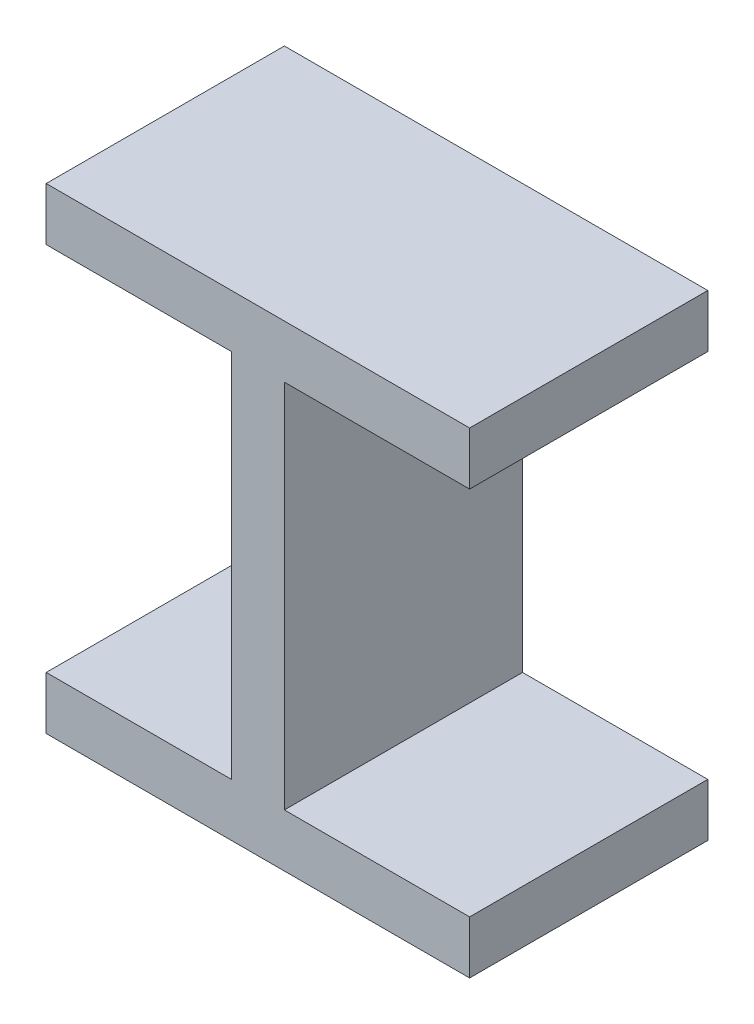
ISO-10303-21;
HEADER;
FILE_DESCRIPTION(('STEP AP214'),'2;1');
FILE_NAME('part.step','',(''),(''),'','','');
FILE_SCHEMA(('AUTOMOTIVE_DESIGN { 1 0 10303 214 1 1 1 1 }'));
ENDSEC;
DATA;
#1=APPLICATION_CONTEXT('core data for automotive mechanical design processes');
#2=APPLICATION_PROTOCOL_DEFINITION('international standard','automotive_design',2000,#1);
#3=PRODUCT_CONTEXT('',#1,'mechanical');
#4=PRODUCT('Part','Part','',(#3));
#5=PRODUCT_RELATED_PRODUCT_CATEGORY('part','',(#4));
#6=PRODUCT_DEFINITION_FORMATION('','',#4);
#7=PRODUCT_DEFINITION_CONTEXT('part definition',#1,'design');
#8=PRODUCT_DEFINITION('design','',#6,#7);
#9=PRODUCT_DEFINITION_SHAPE('','',#8);
#10=(LENGTH_UNIT() NAMED_UNIT(*) SI_UNIT(.MILLI.,.METRE.));
#11=(NAMED_UNIT(*) PLANE_ANGLE_UNIT() SI_UNIT($,.RADIAN.));
#12=(NAMED_UNIT(*) SI_UNIT($,.STERADIAN.) SOLID_ANGLE_UNIT());
#13=UNCERTAINTY_MEASURE_WITH_UNIT(LENGTH_MEASURE(1.E-05),#10,'distance_accuracy_value','');
#14=(GEOMETRIC_REPRESENTATION_CONTEXT(3) GLOBAL_UNCERTAINTY_ASSIGNED_CONTEXT((#13)) GLOBAL_UNIT_ASSIGNED_CONTEXT((#10,
#11,#12)) REPRESENTATION_CONTEXT('',''));
#15=CARTESIAN_POINT('',(0.,0.,0.));
#16=DIRECTION('',(0.,0.,1.));
#17=DIRECTION('',(1.,0.,0.));
#18=AXIS2_PLACEMENT_3D('',#15,#16,#17);
#19=CARTESIAN_POINT('',(80.,-90.,90.));
#20=DIRECTION('',(-1.,0.,0.));
#21=DIRECTION('',(0.,-1.,0.));
#22=AXIS2_PLACEMENT_3D('',#19,#20,#21);
#23=PLANE('',#22);
#24=DIRECTION('',(0.,1.,0.));
#25=VECTOR('',#24,1.);
#26=CARTESIAN_POINT('',(80.,-90.,0.));
#27=LINE('',#26,#25);
#28=CARTESIAN_POINT('',(80.,-90.,0.));
#29=VERTEX_POINT('',#28);
#30=CARTESIAN_POINT('',(80.,-70.,0.));
#31=VERTEX_POINT('',#30);
#32=EDGE_CURVE('E157',#29,#31,#27,.T.);
#33=ORIENTED_EDGE('',*,*,#32,.T.);
#34=DIRECTION('',(0.,0.,-1.));
#35=VECTOR('',#34,1.);
#36=CARTESIAN_POINT('',(80.,-70.,90.));
#37=LINE('',#36,#35);
#38=CARTESIAN_POINT('',(80.,-70.,90.));
#39=VERTEX_POINT('',#38);
#40=EDGE_CURVE('E11',#39,#31,#37,.T.);
#41=ORIENTED_EDGE('',*,*,#40,.F.);
#42=DIRECTION('',(0.,1.,0.));
#43=VECTOR('',#42,1.);
#44=CARTESIAN_POINT('',(80.,-90.,90.));
#45=LINE('',#44,#43);
#46=CARTESIAN_POINT('',(80.,-90.,90.));
#47=VERTEX_POINT('',#46);
#48=EDGE_CURVE('E179',#47,#39,#45,.T.);
#49=ORIENTED_EDGE('',*,*,#48,.F.);
#50=DIRECTION('',(0.,0.,-1.));
#51=VECTOR('',#50,1.);
#52=CARTESIAN_POINT('',(80.,-90.,90.));
#53=LINE('',#52,#51);
#54=EDGE_CURVE('E153',#47,#29,#53,.T.);
#55=ORIENTED_EDGE('',*,*,#54,.T.);
#56=EDGE_LOOP('',(#33,#41,#49,#55));
#57=FACE_BOUND('',#56,.T.);
#58=ADVANCED_FACE('F37',(#57),#23,.F.);
#59=CARTESIAN_POINT('',(80.,-70.,90.));
#60=DIRECTION('',(0.,-1.,0.));
#61=DIRECTION('',(1.,0.,0.));
#62=AXIS2_PLACEMENT_3D('',#59,#60,#61);
#63=PLANE('',#62);
#64=DIRECTION('',(-1.,0.,0.));
#65=VECTOR('',#64,1.);
#66=CARTESIAN_POINT('',(80.,-70.,0.));
#67=LINE('',#66,#65);
#68=CARTESIAN_POINT('',(10.,-70.,0.));
#69=VERTEX_POINT('',#68);
#70=EDGE_CURVE('E160',#31,#69,#67,.T.);
#71=ORIENTED_EDGE('',*,*,#70,.T.);
#72=DIRECTION('',(0.,0.,-1.));
#73=VECTOR('',#72,1.);
#74=CARTESIAN_POINT('',(10.,-70.,90.));
#75=LINE('',#74,#73);
#76=CARTESIAN_POINT('',(10.,-70.,90.));
#77=VERTEX_POINT('',#76);
#78=EDGE_CURVE('E45',#77,#69,#75,.T.);
#79=ORIENTED_EDGE('',*,*,#78,.F.);
#80=DIRECTION('',(-1.,0.,0.));
#81=VECTOR('',#80,1.);
#82=CARTESIAN_POINT('',(80.,-70.,90.));
#83=LINE('',#82,#81);
#84=EDGE_CURVE('E108',#39,#77,#83,.T.);
#85=ORIENTED_EDGE('',*,*,#84,.F.);
#86=ORIENTED_EDGE('',*,*,#40,.T.);
#87=EDGE_LOOP('',(#71,#79,#85,#86));
#88=FACE_BOUND('',#87,.T.);
#89=ADVANCED_FACE('F257',(#88),#63,.F.);
#90=CARTESIAN_POINT('',(10.,-70.,90.));
#91=DIRECTION('',(-1.,0.,0.));
#92=DIRECTION('',(0.,0.,1.));
#93=AXIS2_PLACEMENT_3D('',#90,#91,#92);
#94=PLANE('',#93);
#95=DIRECTION('',(0.,1.,0.));
#96=VECTOR('',#95,1.);
#97=CARTESIAN_POINT('',(10.,-70.,0.));
#98=LINE('',#97,#96);
#99=CARTESIAN_POINT('',(10.,70.,0.));
#100=VERTEX_POINT('',#99);
#101=EDGE_CURVE('E162',#69,#100,#98,.T.);
#102=ORIENTED_EDGE('',*,*,#101,.T.);
#103=DIRECTION('',(0.,0.,-1.));
#104=VECTOR('',#103,1.);
#105=CARTESIAN_POINT('',(10.,70.,90.));
#106=LINE('',#105,#104);
#107=CARTESIAN_POINT('',(10.,70.,90.));
#108=VERTEX_POINT('',#107);
#109=EDGE_CURVE('E198',#108,#100,#106,.T.);
#110=ORIENTED_EDGE('',*,*,#109,.F.);
#111=DIRECTION('',(0.,1.,0.));
#112=VECTOR('',#111,1.);
#113=CARTESIAN_POINT('',(10.,-70.,90.));
#114=LINE('',#113,#112);
#115=EDGE_CURVE('E206',#77,#108,#114,.T.);
#116=ORIENTED_EDGE('',*,*,#115,.F.);
#117=ORIENTED_EDGE('',*,*,#78,.T.);
#118=EDGE_LOOP('',(#102,#110,#116,#117));
#119=FACE_BOUND('',#118,.T.);
#120=ADVANCED_FACE('F204',(#119),#94,.F.);
#121=CARTESIAN_POINT('',(10.,70.,90.));
#122=DIRECTION('',(0.,1.,0.));
#123=DIRECTION('',(-1.,0.,0.));
#124=AXIS2_PLACEMENT_3D('',#121,#122,#123);
#125=PLANE('',#124);
#126=DIRECTION('',(1.,0.,0.));
#127=VECTOR('',#126,1.);
#128=CARTESIAN_POINT('',(10.,70.,0.));
#129=LINE('',#128,#127);
#130=CARTESIAN_POINT('',(80.,70.,0.));
#131=VERTEX_POINT('',#130);
#132=EDGE_CURVE('E164',#100,#131,#129,.T.);
#133=ORIENTED_EDGE('',*,*,#132,.T.);
#134=DIRECTION('',(0.,0.,-1.));
#135=VECTOR('',#134,1.);
#136=CARTESIAN_POINT('',(80.,70.,90.));
#137=LINE('',#136,#135);
#138=CARTESIAN_POINT('',(80.,70.,90.));
#139=VERTEX_POINT('',#138);
#140=EDGE_CURVE('E195',#139,#131,#137,.T.);
#141=ORIENTED_EDGE('',*,*,#140,.F.);
#142=DIRECTION('',(1.,0.,0.));
#143=VECTOR('',#142,1.);
#144=CARTESIAN_POINT('',(10.,70.,90.));
#145=LINE('',#144,#143);
#146=EDGE_CURVE('E224',#108,#139,#145,.T.);
#147=ORIENTED_EDGE('',*,*,#146,.F.);
#148=ORIENTED_EDGE('',*,*,#109,.T.);
#149=EDGE_LOOP('',(#133,#141,#147,#148));
#150=FACE_BOUND('',#149,.T.);
#151=ADVANCED_FACE('F215',(#150),#125,.F.);
#152=CARTESIAN_POINT('',(80.,70.,90.));
#153=DIRECTION('',(-1.,0.,0.));
#154=DIRECTION('',(0.,-1.,0.));
#155=AXIS2_PLACEMENT_3D('',#152,#153,#154);
#156=PLANE('',#155);
#157=DIRECTION('',(0.,1.,0.));
#158=VECTOR('',#157,1.);
#159=CARTESIAN_POINT('',(80.,70.,0.));
#160=LINE('',#159,#158);
#161=CARTESIAN_POINT('',(80.,90.,0.));
#162=VERTEX_POINT('',#161);
#163=EDGE_CURVE('E166',#131,#162,#160,.T.);
#164=ORIENTED_EDGE('',*,*,#163,.T.);
#165=DIRECTION('',(0.,0.,-1.));
#166=VECTOR('',#165,1.);
#167=CARTESIAN_POINT('',(80.,90.,90.));
#168=LINE('',#167,#166);
#169=CARTESIAN_POINT('',(80.,90.,90.));
#170=VERTEX_POINT('',#169);
#171=EDGE_CURVE('E192',#170,#162,#168,.T.);
#172=ORIENTED_EDGE('',*,*,#171,.F.);
#173=DIRECTION('',(0.,1.,0.));
#174=VECTOR('',#173,1.);
#175=CARTESIAN_POINT('',(80.,70.,90.));
#176=LINE('',#175,#174);
#177=EDGE_CURVE('E221',#139,#170,#176,.T.);
#178=ORIENTED_EDGE('',*,*,#177,.F.);
#179=ORIENTED_EDGE('',*,*,#140,.T.);
#180=EDGE_LOOP('',(#164,#172,#178,#179));
#181=FACE_BOUND('',#180,.T.);
#182=ADVANCED_FACE('F219',(#181),#156,.F.);
#183=CARTESIAN_POINT('',(-80.,90.,90.));
#184=DIRECTION('',(0.,-1.,0.));
#185=DIRECTION('',(0.,0.,-1.));
#186=AXIS2_PLACEMENT_3D('',#183,#184,#185);
#187=PLANE('',#186);
#188=DIRECTION('',(-1.,0.,0.));
#189=VECTOR('',#188,1.);
#190=CARTESIAN_POINT('',(-80.,90.,0.));
#191=LINE('',#190,#189);
#192=CARTESIAN_POINT('',(-80.,90.,0.));
#193=VERTEX_POINT('',#192);
#194=EDGE_CURVE('E168',#162,#193,#191,.T.);
#195=ORIENTED_EDGE('',*,*,#194,.T.);
#196=DIRECTION('',(0.,0.,-1.));
#197=VECTOR('',#196,1.);
#198=CARTESIAN_POINT('',(-80.,90.,90.));
#199=LINE('',#198,#197);
#200=CARTESIAN_POINT('',(-80.,90.,90.));
#201=VERTEX_POINT('',#200);
#202=EDGE_CURVE('E189',#201,#193,#199,.T.);
#203=ORIENTED_EDGE('',*,*,#202,.F.);
#204=DIRECTION('',(-1.,0.,0.));
#205=VECTOR('',#204,1.);
#206=CARTESIAN_POINT('',(-80.,90.,90.));
#207=LINE('',#206,#205);
#208=EDGE_CURVE('E223',#170,#201,#207,.T.);
#209=ORIENTED_EDGE('',*,*,#208,.F.);
#210=ORIENTED_EDGE('',*,*,#171,.T.);
#211=EDGE_LOOP('',(#195,#203,#209,#210));
#212=FACE_BOUND('',#211,.T.);
#213=ADVANCED_FACE('F270',(#212),#187,.F.);
#214=CARTESIAN_POINT('',(-80.,70.,90.));
#215=DIRECTION('',(1.,0.,0.));
#216=DIRECTION('',(0.,1.,0.));
#217=AXIS2_PLACEMENT_3D('',#214,#215,#216);
#218=PLANE('',#217);
#219=DIRECTION('',(0.,-1.,0.));
#220=VECTOR('',#219,1.);
#221=CARTESIAN_POINT('',(-80.,70.,0.));
#222=LINE('',#221,#220);
#223=CARTESIAN_POINT('',(-80.,70.,0.));
#224=VERTEX_POINT('',#223);
#225=EDGE_CURVE('E170',#193,#224,#222,.T.);
#226=ORIENTED_EDGE('',*,*,#225,.T.);
#227=DIRECTION('',(0.,0.,-1.));
#228=VECTOR('',#227,1.);
#229=CARTESIAN_POINT('',(-80.,70.,90.));
#230=LINE('',#229,#228);
#231=CARTESIAN_POINT('',(-80.,70.,90.));
#232=VERTEX_POINT('',#231);
#233=EDGE_CURVE('E186',#232,#224,#230,.T.);
#234=ORIENTED_EDGE('',*,*,#233,.F.);
#235=DIRECTION('',(0.,-1.,0.));
#236=VECTOR('',#235,1.);
#237=CARTESIAN_POINT('',(-80.,70.,90.));
#238=LINE('',#237,#236);
#239=EDGE_CURVE('E226',#201,#232,#238,.T.);
#240=ORIENTED_EDGE('',*,*,#239,.F.);
#241=ORIENTED_EDGE('',*,*,#202,.T.);
#242=EDGE_LOOP('',(#226,#234,#240,#241));
#243=FACE_BOUND('',#242,.T.);
#244=ADVANCED_FACE('F273',(#243),#218,.F.);
#245=CARTESIAN_POINT('',(-10.,70.,90.));
#246=DIRECTION('',(0.,1.,0.));
#247=DIRECTION('',(-1.,0.,0.));
#248=AXIS2_PLACEMENT_3D('',#245,#246,#247);
#249=PLANE('',#248);
#250=DIRECTION('',(1.,0.,0.));
#251=VECTOR('',#250,1.);
#252=CARTESIAN_POINT('',(-10.,70.,0.));
#253=LINE('',#252,#251);
#254=CARTESIAN_POINT('',(-10.,70.,0.));
#255=VERTEX_POINT('',#254);
#256=EDGE_CURVE('E172',#224,#255,#253,.T.);
#257=ORIENTED_EDGE('',*,*,#256,.T.);
#258=DIRECTION('',(0.,0.,-1.));
#259=VECTOR('',#258,1.);
#260=CARTESIAN_POINT('',(-10.,70.,90.));
#261=LINE('',#260,#259);
#262=CARTESIAN_POINT('',(-10.,70.,90.));
#263=VERTEX_POINT('',#262);
#264=EDGE_CURVE('E183',#263,#255,#261,.T.);
#265=ORIENTED_EDGE('',*,*,#264,.F.);
#266=DIRECTION('',(1.,0.,0.));
#267=VECTOR('',#266,1.);
#268=CARTESIAN_POINT('',(-10.,70.,90.));
#269=LINE('',#268,#267);
#270=EDGE_CURVE('E232',#232,#263,#269,.T.);
#271=ORIENTED_EDGE('',*,*,#270,.F.);
#272=ORIENTED_EDGE('',*,*,#233,.T.);
#273=EDGE_LOOP('',(#257,#265,#271,#272));
#274=FACE_BOUND('',#273,.T.);
#275=ADVANCED_FACE('F238',(#274),#249,.F.);
#276=CARTESIAN_POINT('',(-10.,-70.,90.));
#277=DIRECTION('',(1.,0.,0.));
#278=DIRECTION('',(0.,0.,-1.));
#279=AXIS2_PLACEMENT_3D('',#276,#277,#278);
#280=PLANE('',#279);
#281=DIRECTION('',(0.,-1.,0.));
#282=VECTOR('',#281,1.);
#283=CARTESIAN_POINT('',(-10.,-70.,0.));
#284=LINE('',#283,#282);
#285=CARTESIAN_POINT('',(-10.,-70.,0.));
#286=VERTEX_POINT('',#285);
#287=EDGE_CURVE('E174',#255,#286,#284,.T.);
#288=ORIENTED_EDGE('',*,*,#287,.T.);
#289=DIRECTION('',(0.,0.,-1.));
#290=VECTOR('',#289,1.);
#291=CARTESIAN_POINT('',(-10.,-70.,90.));
#292=LINE('',#291,#290);
#293=CARTESIAN_POINT('',(-10.,-70.,90.));
#294=VERTEX_POINT('',#293);
#295=EDGE_CURVE('E148',#294,#286,#292,.T.);
#296=ORIENTED_EDGE('',*,*,#295,.F.);
#297=DIRECTION('',(0.,-1.,0.));
#298=VECTOR('',#297,1.);
#299=CARTESIAN_POINT('',(-10.,-70.,90.));
#300=LINE('',#299,#298);
#301=EDGE_CURVE('E139',#263,#294,#300,.T.);
#302=ORIENTED_EDGE('',*,*,#301,.F.);
#303=ORIENTED_EDGE('',*,*,#264,.T.);
#304=EDGE_LOOP('',(#288,#296,#302,#303));
#305=FACE_BOUND('',#304,.T.);
#306=ADVANCED_FACE('F242',(#305),#280,.F.);
#307=CARTESIAN_POINT('',(-80.,-70.,90.));
#308=DIRECTION('',(0.,-1.,0.));
#309=DIRECTION('',(1.,0.,0.));
#310=AXIS2_PLACEMENT_3D('',#307,#308,#309);
#311=PLANE('',#310);
#312=DIRECTION('',(-1.,0.,0.));
#313=VECTOR('',#312,1.);
#314=CARTESIAN_POINT('',(-80.,-70.,0.));
#315=LINE('',#314,#313);
#316=CARTESIAN_POINT('',(-80.,-70.,0.));
#317=VERTEX_POINT('',#316);
#318=EDGE_CURVE('E147',#286,#317,#315,.T.);
#319=ORIENTED_EDGE('',*,*,#318,.T.);
#320=DIRECTION('',(0.,0.,-1.));
#321=VECTOR('',#320,1.);
#322=CARTESIAN_POINT('',(-80.,-70.,90.));
#323=LINE('',#322,#321);
#324=CARTESIAN_POINT('',(-80.,-70.,90.));
#325=VERTEX_POINT('',#324);
#326=EDGE_CURVE('E144',#325,#317,#323,.T.);
#327=ORIENTED_EDGE('',*,*,#326,.F.);
#328=DIRECTION('',(-1.,0.,0.));
#329=VECTOR('',#328,1.);
#330=CARTESIAN_POINT('',(-80.,-70.,90.));
#331=LINE('',#330,#329);
#332=EDGE_CURVE('E133',#294,#325,#331,.T.);
#333=ORIENTED_EDGE('',*,*,#332,.F.);
#334=ORIENTED_EDGE('',*,*,#295,.T.);
#335=EDGE_LOOP('',(#319,#327,#333,#334));
#336=FACE_BOUND('',#335,.T.);
#337=ADVANCED_FACE('F145',(#336),#311,.F.);
#338=CARTESIAN_POINT('',(-80.,-90.0000000000001,90.));
#339=DIRECTION('',(1.,0.,0.));
#340=DIRECTION('',(0.,1.,0.));
#341=AXIS2_PLACEMENT_3D('',#338,#339,#340);
#342=PLANE('',#341);
#343=DIRECTION('',(0.,-1.,0.));
#344=VECTOR('',#343,1.);
#345=CARTESIAN_POINT('',(-80.,-90.0000000000001,0.));
#346=LINE('',#345,#344);
#347=CARTESIAN_POINT('',(-80.,-90.0000000000001,0.));
#348=VERTEX_POINT('',#347);
#349=EDGE_CURVE('E94',#317,#348,#346,.T.);
#350=ORIENTED_EDGE('',*,*,#349,.T.);
#351=DIRECTION('',(0.,0.,-1.));
#352=VECTOR('',#351,1.);
#353=CARTESIAN_POINT('',(-80.,-90.0000000000001,90.));
#354=LINE('',#353,#352);
#355=CARTESIAN_POINT('',(-80.,-90.0000000000001,90.));
#356=VERTEX_POINT('',#355);
#357=EDGE_CURVE('E149',#356,#348,#354,.T.);
#358=ORIENTED_EDGE('',*,*,#357,.F.);
#359=DIRECTION('',(0.,-1.,0.));
#360=VECTOR('',#359,1.);
#361=CARTESIAN_POINT('',(-80.,-90.0000000000001,90.));
#362=LINE('',#361,#360);
#363=EDGE_CURVE('E137',#325,#356,#362,.T.);
#364=ORIENTED_EDGE('',*,*,#363,.F.);
#365=ORIENTED_EDGE('',*,*,#326,.T.);
#366=EDGE_LOOP('',(#350,#358,#364,#365));
#367=FACE_BOUND('',#366,.T.);
#368=ADVANCED_FACE('F151',(#367),#342,.F.);
#369=CARTESIAN_POINT('',(80.,-90.,90.));
#370=DIRECTION('',(0.,1.,0.));
#371=DIRECTION('',(-1.,0.,0.));
#372=AXIS2_PLACEMENT_3D('',#369,#370,#371);
#373=PLANE('',#372);
#374=DIRECTION('',(1.,0.,0.));
#375=VECTOR('',#374,1.);
#376=CARTESIAN_POINT('',(80.,-90.,0.));
#377=LINE('',#376,#375);
#378=EDGE_CURVE('E100',#348,#29,#377,.T.);
#379=ORIENTED_EDGE('',*,*,#378,.T.);
#380=ORIENTED_EDGE('',*,*,#54,.F.);
#381=DIRECTION('',(1.,0.,0.));
#382=VECTOR('',#381,1.);
#383=CARTESIAN_POINT('',(80.,-90.,90.));
#384=LINE('',#383,#382);
#385=EDGE_CURVE('E53',#356,#47,#384,.T.);
#386=ORIENTED_EDGE('',*,*,#385,.F.);
#387=ORIENTED_EDGE('',*,*,#357,.T.);
#388=EDGE_LOOP('',(#379,#380,#386,#387));
#389=FACE_BOUND('',#388,.T.);
#390=ADVANCED_FACE('F246',(#389),#373,.F.);
#391=CARTESIAN_POINT('',(0.,0.,90.));
#392=DIRECTION('',(0.,0.,1.));
#393=DIRECTION('',(1.,0.,0.));
#394=AXIS2_PLACEMENT_3D('',#391,#392,#393);
#395=PLANE('',#394);
#396=ORIENTED_EDGE('',*,*,#48,.T.);
#397=ORIENTED_EDGE('',*,*,#84,.T.);
#398=ORIENTED_EDGE('',*,*,#115,.T.);
#399=ORIENTED_EDGE('',*,*,#146,.T.);
#400=ORIENTED_EDGE('',*,*,#177,.T.);
#401=ORIENTED_EDGE('',*,*,#208,.T.);
#402=ORIENTED_EDGE('',*,*,#239,.T.);
#403=ORIENTED_EDGE('',*,*,#270,.T.);
#404=ORIENTED_EDGE('',*,*,#301,.T.);
#405=ORIENTED_EDGE('',*,*,#332,.T.);
#406=ORIENTED_EDGE('',*,*,#363,.T.);
#407=ORIENTED_EDGE('',*,*,#385,.T.);
#408=EDGE_LOOP('',(#396,#397,#398,#399,#400,#401,#402,#403,#404,#405,#406,#407));
#409=FACE_BOUND('',#408,.T.);
#410=ADVANCED_FACE('F135',(#409),#395,.T.);
#411=CARTESIAN_POINT('',(0.,0.,0.));
#412=DIRECTION('',(0.,0.,1.));
#413=DIRECTION('',(1.,0.,0.));
#414=AXIS2_PLACEMENT_3D('',#411,#412,#413);
#415=PLANE('',#414);
#416=ORIENTED_EDGE('',*,*,#32,.F.);
#417=ORIENTED_EDGE('',*,*,#378,.F.);
#418=ORIENTED_EDGE('',*,*,#349,.F.);
#419=ORIENTED_EDGE('',*,*,#318,.F.);
#420=ORIENTED_EDGE('',*,*,#287,.F.);
#421=ORIENTED_EDGE('',*,*,#256,.F.);
#422=ORIENTED_EDGE('',*,*,#225,.F.);
#423=ORIENTED_EDGE('',*,*,#194,.F.);
#424=ORIENTED_EDGE('',*,*,#163,.F.);
#425=ORIENTED_EDGE('',*,*,#132,.F.);
#426=ORIENTED_EDGE('',*,*,#101,.F.);
#427=ORIENTED_EDGE('',*,*,#70,.F.);
#428=EDGE_LOOP('',(#416,#417,#418,#419,#420,#421,#422,#423,#424,#425,#426,#427));
#429=FACE_BOUND('',#428,.T.);
#430=ADVANCED_FACE('F210',(#429),#415,.F.);
#431=CLOSED_SHELL('',(#58,#89,#120,#151,#182,#213,#244,#275,#306,#337,#368,#390,#410,#430));
#432=MANIFOLD_SOLID_BREP('B2',#431);
#433=ADVANCED_BREP_SHAPE_REPRESENTATION('',(#18,#432),#14);
#434=SHAPE_DEFINITION_REPRESENTATION(#9,#433);
ENDSEC;
END-ISO-10303-21;
